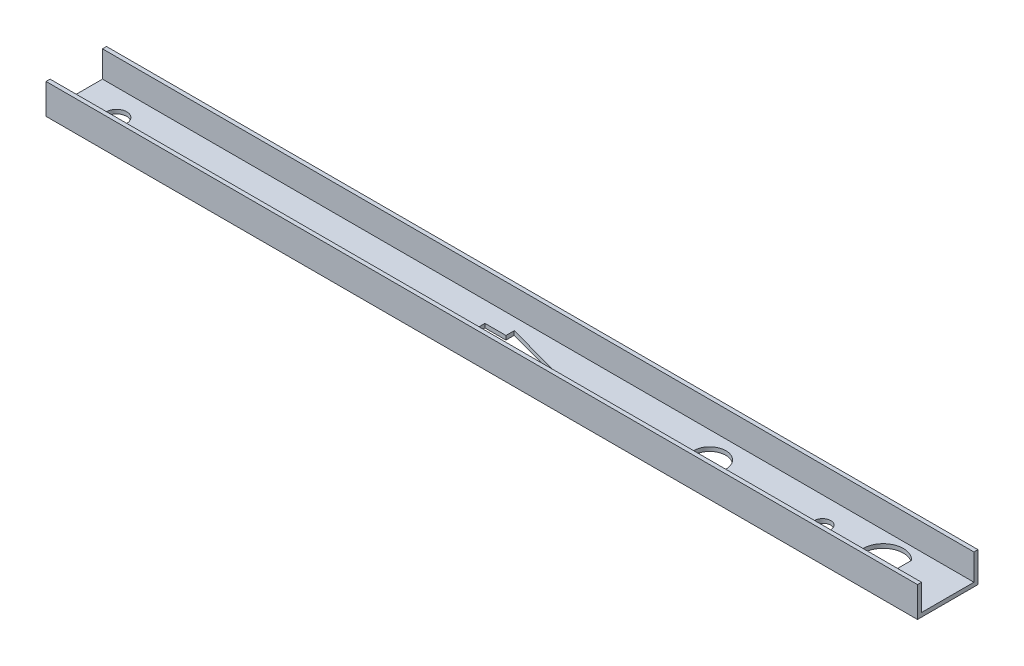
ISO-10303-21;
HEADER;
FILE_DESCRIPTION(('STEP AP214'),'2;1');
FILE_NAME('part.step','',(''),(''),'','','');
FILE_SCHEMA(('AUTOMOTIVE_DESIGN { 1 0 10303 214 1 1 1 1 }'));
ENDSEC;
DATA;
#1=APPLICATION_CONTEXT('core data for automotive mechanical design processes');
#2=APPLICATION_PROTOCOL_DEFINITION('international standard','automotive_design',2000,#1);
#3=PRODUCT_CONTEXT('',#1,'mechanical');
#4=PRODUCT('Part','Part','',(#3));
#5=PRODUCT_RELATED_PRODUCT_CATEGORY('part','',(#4));
#6=PRODUCT_DEFINITION_FORMATION('','',#4);
#7=PRODUCT_DEFINITION_CONTEXT('part definition',#1,'design');
#8=PRODUCT_DEFINITION('design','',#6,#7);
#9=PRODUCT_DEFINITION_SHAPE('','',#8);
#10=(LENGTH_UNIT() NAMED_UNIT(*) SI_UNIT(.MILLI.,.METRE.));
#11=(NAMED_UNIT(*) PLANE_ANGLE_UNIT() SI_UNIT($,.RADIAN.));
#12=(NAMED_UNIT(*) SI_UNIT($,.STERADIAN.) SOLID_ANGLE_UNIT());
#13=UNCERTAINTY_MEASURE_WITH_UNIT(LENGTH_MEASURE(1.E-05),#10,'distance_accuracy_value','');
#14=(GEOMETRIC_REPRESENTATION_CONTEXT(3) GLOBAL_UNCERTAINTY_ASSIGNED_CONTEXT((#13)) GLOBAL_UNIT_ASSIGNED_CONTEXT((#10,
#11,#12)) REPRESENTATION_CONTEXT('',''));
#15=CARTESIAN_POINT('',(0.,0.,0.));
#16=DIRECTION('',(0.,0.,1.));
#17=DIRECTION('',(1.,0.,0.));
#18=AXIS2_PLACEMENT_3D('',#15,#16,#17);
#19=CARTESIAN_POINT('',(108.,6.5,6.5));
#20=DIRECTION('',(0.,-1.,0.));
#21=DIRECTION('',(0.,0.,-1.));
#22=AXIS2_PLACEMENT_3D('',#19,#20,#21);
#23=PLANE('',#22);
#24=DIRECTION('',(0.,0.,1.));
#25=VECTOR('',#24,1.);
#26=CARTESIAN_POINT('',(-108.,6.5,6.5));
#27=LINE('',#26,#25);
#28=CARTESIAN_POINT('',(-108.,6.5,6.5));
#29=VERTEX_POINT('',#28);
#30=CARTESIAN_POINT('',(-108.,6.5,7.5));
#31=VERTEX_POINT('',#30);
#32=EDGE_CURVE('E240',#29,#31,#27,.T.);
#33=ORIENTED_EDGE('',*,*,#32,.T.);
#34=DIRECTION('',(-1.,0.,0.));
#35=VECTOR('',#34,1.);
#36=CARTESIAN_POINT('',(108.,6.5,7.5));
#37=LINE('',#36,#35);
#38=CARTESIAN_POINT('',(108.,6.5,7.5));
#39=VERTEX_POINT('',#38);
#40=EDGE_CURVE('E11',#39,#31,#37,.T.);
#41=ORIENTED_EDGE('',*,*,#40,.F.);
#42=DIRECTION('',(0.,0.,1.));
#43=VECTOR('',#42,1.);
#44=CARTESIAN_POINT('',(108.,6.5,6.5));
#45=LINE('',#44,#43);
#46=CARTESIAN_POINT('',(108.,6.5,6.5));
#47=VERTEX_POINT('',#46);
#48=EDGE_CURVE('E243',#47,#39,#45,.T.);
#49=ORIENTED_EDGE('',*,*,#48,.F.);
#50=DIRECTION('',(-1.,0.,0.));
#51=VECTOR('',#50,1.);
#52=CARTESIAN_POINT('',(108.,6.5,6.5));
#53=LINE('',#52,#51);
#54=EDGE_CURVE('E261',#47,#29,#53,.T.);
#55=ORIENTED_EDGE('',*,*,#54,.T.);
#56=EDGE_LOOP('',(#33,#41,#49,#55));
#57=FACE_BOUND('',#56,.T.);
#58=ADVANCED_FACE('F33',(#57),#23,.F.);
#59=CARTESIAN_POINT('',(108.,6.5,7.5));
#60=DIRECTION('',(0.,0.,-1.));
#61=DIRECTION('',(0.,1.,0.));
#62=AXIS2_PLACEMENT_3D('',#59,#60,#61);
#63=PLANE('',#62);
#64=DIRECTION('',(0.,-1.,0.));
#65=VECTOR('',#64,1.);
#66=CARTESIAN_POINT('',(-108.,6.5,7.5));
#67=LINE('',#66,#65);
#68=CARTESIAN_POINT('',(-108.,-1.,7.5));
#69=VERTEX_POINT('',#68);
#70=EDGE_CURVE('E264',#31,#69,#67,.T.);
#71=ORIENTED_EDGE('',*,*,#70,.T.);
#72=DIRECTION('',(-1.,0.,0.));
#73=VECTOR('',#72,1.);
#74=CARTESIAN_POINT('',(108.,-1.,7.5));
#75=LINE('',#74,#73);
#76=CARTESIAN_POINT('',(108.,-1.,7.5));
#77=VERTEX_POINT('',#76);
#78=EDGE_CURVE('E40',#77,#69,#75,.T.);
#79=ORIENTED_EDGE('',*,*,#78,.F.);
#80=DIRECTION('',(0.,-1.,0.));
#81=VECTOR('',#80,1.);
#82=CARTESIAN_POINT('',(108.,6.5,7.5));
#83=LINE('',#82,#81);
#84=EDGE_CURVE('E246',#39,#77,#83,.T.);
#85=ORIENTED_EDGE('',*,*,#84,.F.);
#86=ORIENTED_EDGE('',*,*,#40,.T.);
#87=EDGE_LOOP('',(#71,#79,#85,#86));
#88=FACE_BOUND('',#87,.T.);
#89=ADVANCED_FACE('F320',(#88),#63,.F.);
#90=CARTESIAN_POINT('',(108.,-1.,7.5));
#91=DIRECTION('',(0.,1.,0.));
#92=DIRECTION('',(0.,0.,1.));
#93=AXIS2_PLACEMENT_3D('',#90,#91,#92);
#94=PLANE('',#93);
#95=DIRECTION('',(0.,0.,-1.));
#96=VECTOR('',#95,1.);
#97=CARTESIAN_POINT('',(95.5707142142714,-1.,-3.5));
#98=LINE('',#97,#96);
#99=CARTESIAN_POINT('',(95.5707142142714,-1.,3.5));
#100=VERTEX_POINT('',#99);
#101=CARTESIAN_POINT('',(95.5707142142714,-1.,-3.5));
#102=VERTEX_POINT('',#101);
#103=EDGE_CURVE('E154',#100,#102,#98,.T.);
#104=ORIENTED_EDGE('',*,*,#103,.T.);
#105=CARTESIAN_POINT('',(92.,-1.,0.));
#106=DIRECTION('',(0.,1.,0.));
#107=DIRECTION('',(0.,0.,1.));
#108=AXIS2_PLACEMENT_3D('',#105,#106,#107);
#109=CIRCLE('',#108,5.);
#110=EDGE_CURVE('E47',#102,#100,#109,.T.);
#111=ORIENTED_EDGE('',*,*,#110,.T.);
#112=EDGE_LOOP('',(#104,#111));
#113=FACE_BOUND('',#112,.T.);
#114=DIRECTION('',(0.,0.,1.));
#115=VECTOR('',#114,1.);
#116=CARTESIAN_POINT('',(-2.97013024075214,-1.,-3.51862398510276));
#117=LINE('',#116,#115);
#118=CARTESIAN_POINT('',(-2.97013024075214,-1.,-3.51862398510276));
#119=VERTEX_POINT('',#118);
#120=CARTESIAN_POINT('',(-2.97013024075214,-1.,-1.47348756724204));
#121=VERTEX_POINT('',#120);
#122=EDGE_CURVE('E188',#119,#121,#117,.T.);
#123=ORIENTED_EDGE('',*,*,#122,.T.);
#124=DIRECTION('',(-1.,0.,0.));
#125=VECTOR('',#124,1.);
#126=CARTESIAN_POINT('',(-2.97013024075214,-1.,-1.47348756724204));
#127=LINE('',#126,#125);
#128=CARTESIAN_POINT('',(-8.17593203167034,-1.,-1.47348756724204));
#129=VERTEX_POINT('',#128);
#130=EDGE_CURVE('E169',#121,#129,#127,.T.);
#131=ORIENTED_EDGE('',*,*,#130,.T.);
#132=DIRECTION('',(0.,0.,1.));
#133=VECTOR('',#132,1.);
#134=CARTESIAN_POINT('',(-8.17593203167034,-1.,-1.47348756724204));
#135=LINE('',#134,#133);
#136=CARTESIAN_POINT('',(-8.17593203167034,-1.,1.50125631328265));
#137=VERTEX_POINT('',#136);
#138=EDGE_CURVE('E172',#129,#137,#135,.T.);
#139=ORIENTED_EDGE('',*,*,#138,.T.);
#140=DIRECTION('',(1.,0.,0.));
#141=VECTOR('',#140,1.);
#142=CARTESIAN_POINT('',(-8.17593203167034,-1.,1.50125631328265));
#143=LINE('',#142,#141);
#144=CARTESIAN_POINT('',(-2.97013024075214,-1.,1.50125631328265));
#145=VERTEX_POINT('',#144);
#146=EDGE_CURVE('E176',#137,#145,#143,.T.);
#147=ORIENTED_EDGE('',*,*,#146,.T.);
#148=DIRECTION('',(0.,0.,1.));
#149=VECTOR('',#148,1.);
#150=CARTESIAN_POINT('',(-2.97013024075214,-1.,1.50125631328265));
#151=LINE('',#150,#149);
#152=CARTESIAN_POINT('',(-2.97013024075214,-1.,3.26751049234419));
#153=VERTEX_POINT('',#152);
#154=EDGE_CURVE('E179',#145,#153,#151,.T.);
#155=ORIENTED_EDGE('',*,*,#154,.T.);
#156=DIRECTION('',(0.970305241636515,0.,-0.241883728375234));
#157=VECTOR('',#156,1.);
#158=CARTESIAN_POINT('',(-2.97013024075214,-1.,3.26751049234419));
#159=LINE('',#158,#157);
#160=CARTESIAN_POINT('',(10.1373349828098,-1.,0.));
#161=VERTEX_POINT('',#160);
#162=EDGE_CURVE('E182',#153,#161,#159,.T.);
#163=ORIENTED_EDGE('',*,*,#162,.T.);
#164=DIRECTION('',(-0.965806185070648,0.,-0.259265140115832));
#165=VECTOR('',#164,1.);
#166=CARTESIAN_POINT('',(10.1373349828098,-1.,0.));
#167=LINE('',#166,#165);
#168=EDGE_CURVE('E185',#161,#119,#167,.T.);
#169=ORIENTED_EDGE('',*,*,#168,.T.);
#170=EDGE_LOOP('',(#123,#131,#139,#147,#155,#163,#169));
#171=FACE_BOUND('',#170,.T.);
#172=CARTESIAN_POINT('',(77.,-1.,0.));
#173=DIRECTION('',(0.,1.,0.));
#174=DIRECTION('',(0.,0.,1.));
#175=AXIS2_PLACEMENT_3D('',#172,#173,#174);
#176=CIRCLE('',#175,2.);
#177=CARTESIAN_POINT('',(77.,-1.,2.));
#178=VERTEX_POINT('',#177);
#179=EDGE_CURVE('E225',#178,#178,#176,.T.);
#180=ORIENTED_EDGE('',*,*,#179,.T.);
#181=EDGE_LOOP('',(#180));
#182=FACE_BOUND('',#181,.T.);
#183=CARTESIAN_POINT('',(49.,-1.,0.));
#184=DIRECTION('',(0.,1.,0.));
#185=DIRECTION('',(0.,0.,1.));
#186=AXIS2_PLACEMENT_3D('',#183,#184,#185);
#187=CIRCLE('',#186,4.00000000000001);
#188=CARTESIAN_POINT('',(49.,-1.,4.00000000000001));
#189=VERTEX_POINT('',#188);
#190=EDGE_CURVE('E231',#189,#189,#187,.T.);
#191=ORIENTED_EDGE('',*,*,#190,.T.);
#192=EDGE_LOOP('',(#191));
#193=FACE_BOUND('',#192,.T.);
#194=CARTESIAN_POINT('',(-98.,-1.,0.));
#195=DIRECTION('',(0.,1.,0.));
#196=DIRECTION('',(0.,0.,1.));
#197=AXIS2_PLACEMENT_3D('',#194,#195,#196);
#198=CIRCLE('',#197,2.5);
#199=CARTESIAN_POINT('',(-98.,-1.,2.5));
#200=VERTEX_POINT('',#199);
#201=EDGE_CURVE('E237',#200,#200,#198,.T.);
#202=ORIENTED_EDGE('',*,*,#201,.T.);
#203=EDGE_LOOP('',(#202));
#204=FACE_BOUND('',#203,.T.);
#205=DIRECTION('',(0.,0.,-1.));
#206=VECTOR('',#205,1.);
#207=CARTESIAN_POINT('',(-108.,-1.,7.5));
#208=LINE('',#207,#206);
#209=CARTESIAN_POINT('',(-108.,-1.,-7.5));
#210=VERTEX_POINT('',#209);
#211=EDGE_CURVE('E266',#69,#210,#208,.T.);
#212=ORIENTED_EDGE('',*,*,#211,.T.);
#213=DIRECTION('',(-1.,0.,0.));
#214=VECTOR('',#213,1.);
#215=CARTESIAN_POINT('',(108.,-1.,-7.5));
#216=LINE('',#215,#214);
#217=CARTESIAN_POINT('',(108.,-1.,-7.5));
#218=VERTEX_POINT('',#217);
#219=EDGE_CURVE('E291',#218,#210,#216,.T.);
#220=ORIENTED_EDGE('',*,*,#219,.F.);
#221=DIRECTION('',(0.,0.,-1.));
#222=VECTOR('',#221,1.);
#223=CARTESIAN_POINT('',(108.,-1.,7.5));
#224=LINE('',#223,#222);
#225=EDGE_CURVE('E249',#77,#218,#224,.T.);
#226=ORIENTED_EDGE('',*,*,#225,.F.);
#227=ORIENTED_EDGE('',*,*,#78,.T.);
#228=EDGE_LOOP('',(#212,#220,#226,#227));
#229=FACE_BOUND('',#228,.T.);
#230=ADVANCED_FACE('F160',(#113,#171,#182,#193,#204,#229),#94,.F.);
#231=CARTESIAN_POINT('',(108.,6.5,-7.5));
#232=DIRECTION('',(0.,0.,1.));
#233=DIRECTION('',(0.,-1.,0.));
#234=AXIS2_PLACEMENT_3D('',#231,#232,#233);
#235=PLANE('',#234);
#236=DIRECTION('',(0.,1.,0.));
#237=VECTOR('',#236,1.);
#238=CARTESIAN_POINT('',(-108.,6.5,-7.5));
#239=LINE('',#238,#237);
#240=CARTESIAN_POINT('',(-108.,6.5,-7.5));
#241=VERTEX_POINT('',#240);
#242=EDGE_CURVE('E268',#210,#241,#239,.T.);
#243=ORIENTED_EDGE('',*,*,#242,.T.);
#244=DIRECTION('',(-1.,0.,0.));
#245=VECTOR('',#244,1.);
#246=CARTESIAN_POINT('',(108.,6.5,-7.5));
#247=LINE('',#246,#245);
#248=CARTESIAN_POINT('',(108.,6.5,-7.5));
#249=VERTEX_POINT('',#248);
#250=EDGE_CURVE('E288',#249,#241,#247,.T.);
#251=ORIENTED_EDGE('',*,*,#250,.F.);
#252=DIRECTION('',(0.,1.,0.));
#253=VECTOR('',#252,1.);
#254=CARTESIAN_POINT('',(108.,6.5,-7.5));
#255=LINE('',#254,#253);
#256=EDGE_CURVE('E251',#218,#249,#255,.T.);
#257=ORIENTED_EDGE('',*,*,#256,.F.);
#258=ORIENTED_EDGE('',*,*,#219,.T.);
#259=EDGE_LOOP('',(#243,#251,#257,#258));
#260=FACE_BOUND('',#259,.T.);
#261=ADVANCED_FACE('F308',(#260),#235,.F.);
#262=CARTESIAN_POINT('',(108.,6.5,-6.5));
#263=DIRECTION('',(0.,-1.,0.));
#264=DIRECTION('',(0.,0.,-1.));
#265=AXIS2_PLACEMENT_3D('',#262,#263,#264);
#266=PLANE('',#265);
#267=DIRECTION('',(0.,0.,1.));
#268=VECTOR('',#267,1.);
#269=CARTESIAN_POINT('',(-108.,6.5,-6.5));
#270=LINE('',#269,#268);
#271=CARTESIAN_POINT('',(-108.,6.5,-6.5));
#272=VERTEX_POINT('',#271);
#273=EDGE_CURVE('E270',#241,#272,#270,.T.);
#274=ORIENTED_EDGE('',*,*,#273,.T.);
#275=DIRECTION('',(-1.,0.,0.));
#276=VECTOR('',#275,1.);
#277=CARTESIAN_POINT('',(108.,6.5,-6.5));
#278=LINE('',#277,#276);
#279=CARTESIAN_POINT('',(108.,6.5,-6.5));
#280=VERTEX_POINT('',#279);
#281=EDGE_CURVE('E285',#280,#272,#278,.T.);
#282=ORIENTED_EDGE('',*,*,#281,.F.);
#283=DIRECTION('',(0.,0.,1.));
#284=VECTOR('',#283,1.);
#285=CARTESIAN_POINT('',(108.,6.5,-6.5));
#286=LINE('',#285,#284);
#287=EDGE_CURVE('E253',#249,#280,#286,.T.);
#288=ORIENTED_EDGE('',*,*,#287,.F.);
#289=ORIENTED_EDGE('',*,*,#250,.T.);
#290=EDGE_LOOP('',(#274,#282,#288,#289));
#291=FACE_BOUND('',#290,.T.);
#292=ADVANCED_FACE('F312',(#291),#266,.F.);
#293=CARTESIAN_POINT('',(108.,0.,-6.5));
#294=DIRECTION('',(0.,0.,-1.));
#295=DIRECTION('',(0.,1.,0.));
#296=AXIS2_PLACEMENT_3D('',#293,#294,#295);
#297=PLANE('',#296);
#298=DIRECTION('',(0.,-1.,0.));
#299=VECTOR('',#298,1.);
#300=CARTESIAN_POINT('',(-108.,0.,-6.5));
#301=LINE('',#300,#299);
#302=CARTESIAN_POINT('',(-108.,0.,-6.5));
#303=VERTEX_POINT('',#302);
#304=EDGE_CURVE('E272',#272,#303,#301,.T.);
#305=ORIENTED_EDGE('',*,*,#304,.T.);
#306=DIRECTION('',(-1.,0.,0.));
#307=VECTOR('',#306,1.);
#308=CARTESIAN_POINT('',(108.,0.,-6.5));
#309=LINE('',#308,#307);
#310=CARTESIAN_POINT('',(108.,0.,-6.5));
#311=VERTEX_POINT('',#310);
#312=EDGE_CURVE('E282',#311,#303,#309,.T.);
#313=ORIENTED_EDGE('',*,*,#312,.F.);
#314=DIRECTION('',(0.,-1.,0.));
#315=VECTOR('',#314,1.);
#316=CARTESIAN_POINT('',(108.,0.,-6.5));
#317=LINE('',#316,#315);
#318=EDGE_CURVE('E255',#280,#311,#317,.T.);
#319=ORIENTED_EDGE('',*,*,#318,.F.);
#320=ORIENTED_EDGE('',*,*,#281,.T.);
#321=EDGE_LOOP('',(#305,#313,#319,#320));
#322=FACE_BOUND('',#321,.T.);
#323=ADVANCED_FACE('F333',(#322),#297,.F.);
#324=CARTESIAN_POINT('',(108.,0.,-6.5));
#325=DIRECTION('',(0.,-1.,0.));
#326=DIRECTION('',(0.,0.,-1.));
#327=AXIS2_PLACEMENT_3D('',#324,#325,#326);
#328=PLANE('',#327);
#329=DIRECTION('',(0.,0.,-1.));
#330=VECTOR('',#329,1.);
#331=CARTESIAN_POINT('',(95.5707142142714,0.,-3.5));
#332=LINE('',#331,#330);
#333=CARTESIAN_POINT('',(95.5707142142714,0.,3.5));
#334=VERTEX_POINT('',#333);
#335=CARTESIAN_POINT('',(95.5707142142714,0.,-3.5));
#336=VERTEX_POINT('',#335);
#337=EDGE_CURVE('E162',#334,#336,#332,.T.);
#338=ORIENTED_EDGE('',*,*,#337,.F.);
#339=CARTESIAN_POINT('',(92.,0.,0.));
#340=DIRECTION('',(0.,1.,0.));
#341=DIRECTION('',(0.,0.,1.));
#342=AXIS2_PLACEMENT_3D('',#339,#340,#341);
#343=CIRCLE('',#342,5.);
#344=EDGE_CURVE('E52',#336,#334,#343,.T.);
#345=ORIENTED_EDGE('',*,*,#344,.F.);
#346=EDGE_LOOP('',(#338,#345));
#347=FACE_BOUND('',#346,.T.);
#348=DIRECTION('',(0.,0.,1.));
#349=VECTOR('',#348,1.);
#350=CARTESIAN_POINT('',(-8.17593203167034,0.,-1.47348756724204));
#351=LINE('',#350,#349);
#352=CARTESIAN_POINT('',(-8.17593203167034,0.,-1.47348756724204));
#353=VERTEX_POINT('',#352);
#354=CARTESIAN_POINT('',(-8.17593203167034,0.,1.50125631328265));
#355=VERTEX_POINT('',#354);
#356=EDGE_CURVE('E193',#353,#355,#351,.T.);
#357=ORIENTED_EDGE('',*,*,#356,.F.);
#358=DIRECTION('',(-1.,0.,0.));
#359=VECTOR('',#358,1.);
#360=CARTESIAN_POINT('',(-2.97013024075214,0.,-1.47348756724204));
#361=LINE('',#360,#359);
#362=CARTESIAN_POINT('',(-2.97013024075214,0.,-1.47348756724204));
#363=VERTEX_POINT('',#362);
#364=EDGE_CURVE('E167',#363,#353,#361,.T.);
#365=ORIENTED_EDGE('',*,*,#364,.F.);
#366=DIRECTION('',(0.,0.,1.));
#367=VECTOR('',#366,1.);
#368=CARTESIAN_POINT('',(-2.97013024075214,0.,-3.51862398510276));
#369=LINE('',#368,#367);
#370=CARTESIAN_POINT('',(-2.97013024075214,0.,-3.51862398510276));
#371=VERTEX_POINT('',#370);
#372=EDGE_CURVE('E173',#371,#363,#369,.T.);
#373=ORIENTED_EDGE('',*,*,#372,.F.);
#374=DIRECTION('',(-0.965806185070648,0.,-0.259265140115832));
#375=VECTOR('',#374,1.);
#376=CARTESIAN_POINT('',(10.1373349828098,0.,0.));
#377=LINE('',#376,#375);
#378=CARTESIAN_POINT('',(10.1373349828098,0.,0.));
#379=VERTEX_POINT('',#378);
#380=EDGE_CURVE('E205',#379,#371,#377,.T.);
#381=ORIENTED_EDGE('',*,*,#380,.F.);
#382=DIRECTION('',(0.970305241636515,0.,-0.241883728375234));
#383=VECTOR('',#382,1.);
#384=CARTESIAN_POINT('',(-2.97013024075214,0.,3.26751049234419));
#385=LINE('',#384,#383);
#386=CARTESIAN_POINT('',(-2.97013024075214,0.,3.26751049234419));
#387=VERTEX_POINT('',#386);
#388=EDGE_CURVE('E202',#387,#379,#385,.T.);
#389=ORIENTED_EDGE('',*,*,#388,.F.);
#390=DIRECTION('',(0.,0.,1.));
#391=VECTOR('',#390,1.);
#392=CARTESIAN_POINT('',(-2.97013024075214,0.,1.50125631328265));
#393=LINE('',#392,#391);
#394=CARTESIAN_POINT('',(-2.97013024075214,0.,1.50125631328265));
#395=VERTEX_POINT('',#394);
#396=EDGE_CURVE('E199',#395,#387,#393,.T.);
#397=ORIENTED_EDGE('',*,*,#396,.F.);
#398=DIRECTION('',(1.,0.,0.));
#399=VECTOR('',#398,1.);
#400=CARTESIAN_POINT('',(-8.17593203167034,0.,1.50125631328265));
#401=LINE('',#400,#399);
#402=EDGE_CURVE('E196',#355,#395,#401,.T.);
#403=ORIENTED_EDGE('',*,*,#402,.F.);
#404=EDGE_LOOP('',(#357,#365,#373,#381,#389,#397,#403));
#405=FACE_BOUND('',#404,.T.);
#406=CARTESIAN_POINT('',(77.,0.,0.));
#407=DIRECTION('',(0.,1.,0.));
#408=DIRECTION('',(0.,0.,1.));
#409=AXIS2_PLACEMENT_3D('',#406,#407,#408);
#410=CIRCLE('',#409,2.);
#411=CARTESIAN_POINT('',(77.,0.,2.));
#412=VERTEX_POINT('',#411);
#413=EDGE_CURVE('E212',#412,#412,#410,.T.);
#414=ORIENTED_EDGE('',*,*,#413,.F.);
#415=EDGE_LOOP('',(#414));
#416=FACE_BOUND('',#415,.T.);
#417=CARTESIAN_POINT('',(49.,0.,0.));
#418=DIRECTION('',(0.,1.,0.));
#419=DIRECTION('',(0.,0.,1.));
#420=AXIS2_PLACEMENT_3D('',#417,#418,#419);
#421=CIRCLE('',#420,4.00000000000001);
#422=CARTESIAN_POINT('',(49.,0.,4.00000000000001));
#423=VERTEX_POINT('',#422);
#424=EDGE_CURVE('E228',#423,#423,#421,.T.);
#425=ORIENTED_EDGE('',*,*,#424,.F.);
#426=EDGE_LOOP('',(#425));
#427=FACE_BOUND('',#426,.T.);
#428=CARTESIAN_POINT('',(-98.,0.,0.));
#429=DIRECTION('',(0.,1.,0.));
#430=DIRECTION('',(0.,0.,1.));
#431=AXIS2_PLACEMENT_3D('',#428,#429,#430);
#432=CIRCLE('',#431,2.5);
#433=CARTESIAN_POINT('',(-98.,0.,2.5));
#434=VERTEX_POINT('',#433);
#435=EDGE_CURVE('E234',#434,#434,#432,.T.);
#436=ORIENTED_EDGE('',*,*,#435,.F.);
#437=EDGE_LOOP('',(#436));
#438=FACE_BOUND('',#437,.T.);
#439=DIRECTION('',(0.,0.,1.));
#440=VECTOR('',#439,1.);
#441=CARTESIAN_POINT('',(-108.,0.,-6.5));
#442=LINE('',#441,#440);
#443=CARTESIAN_POINT('',(-108.,0.,6.5));
#444=VERTEX_POINT('',#443);
#445=EDGE_CURVE('E274',#303,#444,#442,.T.);
#446=ORIENTED_EDGE('',*,*,#445,.T.);
#447=DIRECTION('',(-1.,0.,0.));
#448=VECTOR('',#447,1.);
#449=CARTESIAN_POINT('',(108.,0.,6.5));
#450=LINE('',#449,#448);
#451=CARTESIAN_POINT('',(108.,0.,6.5));
#452=VERTEX_POINT('',#451);
#453=EDGE_CURVE('E279',#452,#444,#450,.T.);
#454=ORIENTED_EDGE('',*,*,#453,.F.);
#455=DIRECTION('',(0.,0.,1.));
#456=VECTOR('',#455,1.);
#457=CARTESIAN_POINT('',(108.,0.,-6.5));
#458=LINE('',#457,#456);
#459=EDGE_CURVE('E257',#311,#452,#458,.T.);
#460=ORIENTED_EDGE('',*,*,#459,.F.);
#461=ORIENTED_EDGE('',*,*,#312,.T.);
#462=EDGE_LOOP('',(#446,#454,#460,#461));
#463=FACE_BOUND('',#462,.T.);
#464=ADVANCED_FACE('F331',(#347,#405,#416,#427,#438,#463),#328,.F.);
#465=CARTESIAN_POINT('',(108.,0.,6.5));
#466=DIRECTION('',(0.,0.,1.));
#467=DIRECTION('',(0.,-1.,0.));
#468=AXIS2_PLACEMENT_3D('',#465,#466,#467);
#469=PLANE('',#468);
#470=DIRECTION('',(0.,1.,0.));
#471=VECTOR('',#470,1.);
#472=CARTESIAN_POINT('',(-108.,0.,6.5));
#473=LINE('',#472,#471);
#474=EDGE_CURVE('E247',#444,#29,#473,.T.);
#475=ORIENTED_EDGE('',*,*,#474,.T.);
#476=ORIENTED_EDGE('',*,*,#54,.F.);
#477=DIRECTION('',(0.,1.,0.));
#478=VECTOR('',#477,1.);
#479=CARTESIAN_POINT('',(108.,0.,6.5));
#480=LINE('',#479,#478);
#481=EDGE_CURVE('E259',#452,#47,#480,.T.);
#482=ORIENTED_EDGE('',*,*,#481,.F.);
#483=ORIENTED_EDGE('',*,*,#453,.T.);
#484=EDGE_LOOP('',(#475,#476,#482,#483));
#485=FACE_BOUND('',#484,.T.);
#486=ADVANCED_FACE('F326',(#485),#469,.F.);
#487=CARTESIAN_POINT('',(108.,0.,0.));
#488=DIRECTION('',(1.,0.,0.));
#489=DIRECTION('',(0.,0.,-1.));
#490=AXIS2_PLACEMENT_3D('',#487,#488,#489);
#491=PLANE('',#490);
#492=ORIENTED_EDGE('',*,*,#48,.T.);
#493=ORIENTED_EDGE('',*,*,#84,.T.);
#494=ORIENTED_EDGE('',*,*,#225,.T.);
#495=ORIENTED_EDGE('',*,*,#256,.T.);
#496=ORIENTED_EDGE('',*,*,#287,.T.);
#497=ORIENTED_EDGE('',*,*,#318,.T.);
#498=ORIENTED_EDGE('',*,*,#459,.T.);
#499=ORIENTED_EDGE('',*,*,#481,.T.);
#500=EDGE_LOOP('',(#492,#493,#494,#495,#496,#497,#498,#499));
#501=FACE_BOUND('',#500,.T.);
#502=ADVANCED_FACE('F316',(#501),#491,.T.);
#503=CARTESIAN_POINT('',(-108.,0.,0.));
#504=DIRECTION('',(1.,0.,0.));
#505=DIRECTION('',(0.,0.,-1.));
#506=AXIS2_PLACEMENT_3D('',#503,#504,#505);
#507=PLANE('',#506);
#508=ORIENTED_EDGE('',*,*,#32,.F.);
#509=ORIENTED_EDGE('',*,*,#474,.F.);
#510=ORIENTED_EDGE('',*,*,#445,.F.);
#511=ORIENTED_EDGE('',*,*,#304,.F.);
#512=ORIENTED_EDGE('',*,*,#273,.F.);
#513=ORIENTED_EDGE('',*,*,#242,.F.);
#514=ORIENTED_EDGE('',*,*,#211,.F.);
#515=ORIENTED_EDGE('',*,*,#70,.F.);
#516=EDGE_LOOP('',(#508,#509,#510,#511,#512,#513,#514,#515));
#517=FACE_BOUND('',#516,.T.);
#518=ADVANCED_FACE('F303',(#517),#507,.F.);
#519=CARTESIAN_POINT('',(-98.,-1.,0.));
#520=DIRECTION('',(0.,1.,0.));
#521=DIRECTION('',(0.,0.,1.));
#522=AXIS2_PLACEMENT_3D('',#519,#520,#521);
#523=CYLINDRICAL_SURFACE('',#522,2.5);
#524=ORIENTED_EDGE('',*,*,#201,.F.);
#525=EDGE_LOOP('',(#524));
#526=FACE_BOUND('',#525,.T.);
#527=ORIENTED_EDGE('',*,*,#435,.T.);
#528=EDGE_LOOP('',(#527));
#529=FACE_BOUND('',#528,.T.);
#530=ADVANCED_FACE('F390',(#526,#529),#523,.F.);
#531=CARTESIAN_POINT('',(49.,-1.,0.));
#532=DIRECTION('',(0.,1.,0.));
#533=DIRECTION('',(0.,0.,1.));
#534=AXIS2_PLACEMENT_3D('',#531,#532,#533);
#535=CYLINDRICAL_SURFACE('',#534,4.00000000000001);
#536=ORIENTED_EDGE('',*,*,#190,.F.);
#537=EDGE_LOOP('',(#536));
#538=FACE_BOUND('',#537,.T.);
#539=ORIENTED_EDGE('',*,*,#424,.T.);
#540=EDGE_LOOP('',(#539));
#541=FACE_BOUND('',#540,.T.);
#542=ADVANCED_FACE('F410',(#538,#541),#535,.F.);
#543=CARTESIAN_POINT('',(77.,-1.,0.));
#544=DIRECTION('',(0.,1.,0.));
#545=DIRECTION('',(0.,0.,1.));
#546=AXIS2_PLACEMENT_3D('',#543,#544,#545);
#547=CYLINDRICAL_SURFACE('',#546,2.);
#548=ORIENTED_EDGE('',*,*,#179,.F.);
#549=EDGE_LOOP('',(#548));
#550=FACE_BOUND('',#549,.T.);
#551=ORIENTED_EDGE('',*,*,#413,.T.);
#552=EDGE_LOOP('',(#551));
#553=FACE_BOUND('',#552,.T.);
#554=ADVANCED_FACE('F420',(#550,#553),#547,.F.);
#555=CARTESIAN_POINT('',(-2.97013024075214,-1.,-1.47348756724204));
#556=DIRECTION('',(0.,0.,-1.));
#557=DIRECTION('',(0.,1.,0.));
#558=AXIS2_PLACEMENT_3D('',#555,#556,#557);
#559=PLANE('',#558);
#560=ORIENTED_EDGE('',*,*,#364,.T.);
#561=DIRECTION('',(0.,1.,0.));
#562=VECTOR('',#561,1.);
#563=CARTESIAN_POINT('',(-8.17593203167034,-1.,-1.47348756724204));
#564=LINE('',#563,#562);
#565=EDGE_CURVE('E191',#129,#353,#564,.T.);
#566=ORIENTED_EDGE('',*,*,#565,.F.);
#567=ORIENTED_EDGE('',*,*,#130,.F.);
#568=DIRECTION('',(0.,1.,0.));
#569=VECTOR('',#568,1.);
#570=CARTESIAN_POINT('',(-2.97013024075214,-1.,-1.47348756724204));
#571=LINE('',#570,#569);
#572=EDGE_CURVE('E210',#121,#363,#571,.T.);
#573=ORIENTED_EDGE('',*,*,#572,.T.);
#574=EDGE_LOOP('',(#560,#566,#567,#573));
#575=FACE_BOUND('',#574,.T.);
#576=ADVANCED_FACE('F430',(#575),#559,.F.);
#577=CARTESIAN_POINT('',(-2.97013024075214,-1.,-3.51862398510276));
#578=DIRECTION('',(-1.,0.,0.));
#579=DIRECTION('',(0.,0.,1.));
#580=AXIS2_PLACEMENT_3D('',#577,#578,#579);
#581=PLANE('',#580);
#582=ORIENTED_EDGE('',*,*,#372,.T.);
#583=ORIENTED_EDGE('',*,*,#572,.F.);
#584=ORIENTED_EDGE('',*,*,#122,.F.);
#585=DIRECTION('',(0.,1.,0.));
#586=VECTOR('',#585,1.);
#587=CARTESIAN_POINT('',(-2.97013024075214,-1.,-3.51862398510276));
#588=LINE('',#587,#586);
#589=EDGE_CURVE('E213',#119,#371,#588,.T.);
#590=ORIENTED_EDGE('',*,*,#589,.T.);
#591=EDGE_LOOP('',(#582,#583,#584,#590));
#592=FACE_BOUND('',#591,.T.);
#593=ADVANCED_FACE('F440',(#592),#581,.F.);
#594=CARTESIAN_POINT('',(10.1373349828098,-1.,0.));
#595=DIRECTION('',(0.259265140115832,0.,-0.965806185070648));
#596=DIRECTION('',(-0.965806185070648,0.,-0.259265140115832));
#597=AXIS2_PLACEMENT_3D('',#594,#595,#596);
#598=PLANE('',#597);
#599=ORIENTED_EDGE('',*,*,#380,.T.);
#600=ORIENTED_EDGE('',*,*,#589,.F.);
#601=ORIENTED_EDGE('',*,*,#168,.F.);
#602=DIRECTION('',(0.,1.,0.));
#603=VECTOR('',#602,1.);
#604=CARTESIAN_POINT('',(10.1373349828098,-1.,0.));
#605=LINE('',#604,#603);
#606=EDGE_CURVE('E215',#161,#379,#605,.T.);
#607=ORIENTED_EDGE('',*,*,#606,.T.);
#608=EDGE_LOOP('',(#599,#600,#601,#607));
#609=FACE_BOUND('',#608,.T.);
#610=ADVANCED_FACE('F450',(#609),#598,.F.);
#611=CARTESIAN_POINT('',(-2.97013024075214,-1.,3.26751049234419));
#612=DIRECTION('',(0.241883728375234,0.,0.970305241636515));
#613=DIRECTION('',(0.970305241636515,0.,-0.241883728375234));
#614=AXIS2_PLACEMENT_3D('',#611,#612,#613);
#615=PLANE('',#614);
#616=ORIENTED_EDGE('',*,*,#388,.T.);
#617=ORIENTED_EDGE('',*,*,#606,.F.);
#618=ORIENTED_EDGE('',*,*,#162,.F.);
#619=DIRECTION('',(0.,1.,0.));
#620=VECTOR('',#619,1.);
#621=CARTESIAN_POINT('',(-2.97013024075214,-1.,3.26751049234419));
#622=LINE('',#621,#620);
#623=EDGE_CURVE('E217',#153,#387,#622,.T.);
#624=ORIENTED_EDGE('',*,*,#623,.T.);
#625=EDGE_LOOP('',(#616,#617,#618,#624));
#626=FACE_BOUND('',#625,.T.);
#627=ADVANCED_FACE('F460',(#626),#615,.F.);
#628=CARTESIAN_POINT('',(-2.97013024075214,-1.,1.50125631328265));
#629=DIRECTION('',(-1.,0.,0.));
#630=DIRECTION('',(0.,0.,1.));
#631=AXIS2_PLACEMENT_3D('',#628,#629,#630);
#632=PLANE('',#631);
#633=ORIENTED_EDGE('',*,*,#396,.T.);
#634=ORIENTED_EDGE('',*,*,#623,.F.);
#635=ORIENTED_EDGE('',*,*,#154,.F.);
#636=DIRECTION('',(0.,1.,0.));
#637=VECTOR('',#636,1.);
#638=CARTESIAN_POINT('',(-2.97013024075214,-1.,1.50125631328265));
#639=LINE('',#638,#637);
#640=EDGE_CURVE('E219',#145,#395,#639,.T.);
#641=ORIENTED_EDGE('',*,*,#640,.T.);
#642=EDGE_LOOP('',(#633,#634,#635,#641));
#643=FACE_BOUND('',#642,.T.);
#644=ADVANCED_FACE('F470',(#643),#632,.F.);
#645=CARTESIAN_POINT('',(-8.17593203167034,-1.,1.50125631328265));
#646=DIRECTION('',(0.,0.,1.));
#647=DIRECTION('',(0.,-1.,0.));
#648=AXIS2_PLACEMENT_3D('',#645,#646,#647);
#649=PLANE('',#648);
#650=ORIENTED_EDGE('',*,*,#402,.T.);
#651=ORIENTED_EDGE('',*,*,#640,.F.);
#652=ORIENTED_EDGE('',*,*,#146,.F.);
#653=DIRECTION('',(0.,1.,0.));
#654=VECTOR('',#653,1.);
#655=CARTESIAN_POINT('',(-8.17593203167034,-1.,1.50125631328265));
#656=LINE('',#655,#654);
#657=EDGE_CURVE('E221',#137,#355,#656,.T.);
#658=ORIENTED_EDGE('',*,*,#657,.T.);
#659=EDGE_LOOP('',(#650,#651,#652,#658));
#660=FACE_BOUND('',#659,.T.);
#661=ADVANCED_FACE('F480',(#660),#649,.F.);
#662=CARTESIAN_POINT('',(-8.17593203167034,-1.,-1.47348756724204));
#663=DIRECTION('',(-1.,0.,0.));
#664=DIRECTION('',(0.,0.,1.));
#665=AXIS2_PLACEMENT_3D('',#662,#663,#664);
#666=PLANE('',#665);
#667=ORIENTED_EDGE('',*,*,#356,.T.);
#668=ORIENTED_EDGE('',*,*,#657,.F.);
#669=ORIENTED_EDGE('',*,*,#138,.F.);
#670=ORIENTED_EDGE('',*,*,#565,.T.);
#671=EDGE_LOOP('',(#667,#668,#669,#670));
#672=FACE_BOUND('',#671,.T.);
#673=ADVANCED_FACE('F490',(#672),#666,.F.);
#674=CARTESIAN_POINT('',(92.,-1.,0.));
#675=DIRECTION('',(0.,1.,0.));
#676=DIRECTION('',(0.,0.,1.));
#677=AXIS2_PLACEMENT_3D('',#674,#675,#676);
#678=CYLINDRICAL_SURFACE('',#677,5.);
#679=ORIENTED_EDGE('',*,*,#344,.T.);
#680=DIRECTION('',(0.,1.,0.));
#681=VECTOR('',#680,1.);
#682=CARTESIAN_POINT('',(95.5707142142714,-1.,3.5));
#683=LINE('',#682,#681);
#684=EDGE_CURVE('E147',#100,#334,#683,.T.);
#685=ORIENTED_EDGE('',*,*,#684,.F.);
#686=ORIENTED_EDGE('',*,*,#110,.F.);
#687=DIRECTION('',(0.,1.,0.));
#688=VECTOR('',#687,1.);
#689=CARTESIAN_POINT('',(95.5707142142714,-1.,-3.5));
#690=LINE('',#689,#688);
#691=EDGE_CURVE('E153',#102,#336,#690,.T.);
#692=ORIENTED_EDGE('',*,*,#691,.T.);
#693=EDGE_LOOP('',(#679,#685,#686,#692));
#694=FACE_BOUND('',#693,.T.);
#695=ADVANCED_FACE('F149',(#694),#678,.F.);
#696=CARTESIAN_POINT('',(95.5707142142714,-1.,-3.5));
#697=DIRECTION('',(1.,0.,0.));
#698=DIRECTION('',(0.,0.,-1.));
#699=AXIS2_PLACEMENT_3D('',#696,#697,#698);
#700=PLANE('',#699);
#701=ORIENTED_EDGE('',*,*,#337,.T.);
#702=ORIENTED_EDGE('',*,*,#691,.F.);
#703=ORIENTED_EDGE('',*,*,#103,.F.);
#704=ORIENTED_EDGE('',*,*,#684,.T.);
#705=EDGE_LOOP('',(#701,#702,#703,#704));
#706=FACE_BOUND('',#705,.T.);
#707=ADVANCED_FACE('F157',(#706),#700,.F.);
#708=CLOSED_SHELL('',(#58,#89,#230,#261,#292,#323,#464,#486,#502,#518,#530,#542,#554,#576,#593,
#610,#627,#644,#661,#673,#695,#707));
#709=MANIFOLD_SOLID_BREP('B2',#708);
#710=ADVANCED_BREP_SHAPE_REPRESENTATION('',(#18,#709),#14);
#711=SHAPE_DEFINITION_REPRESENTATION(#9,#710);
ENDSEC;
END-ISO-10303-21;
